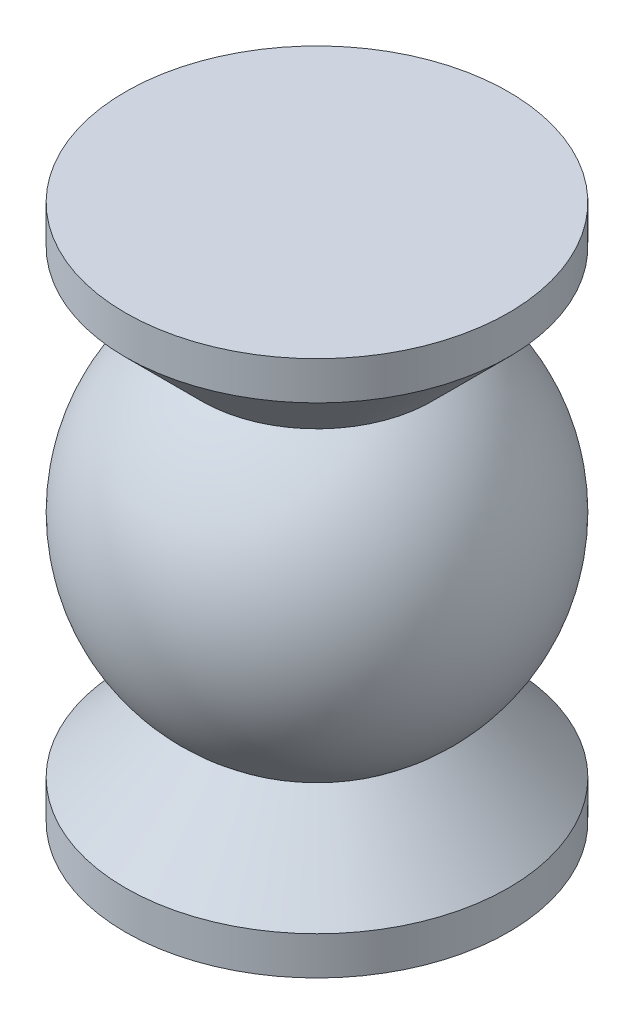
ISO-10303-21;
HEADER;
FILE_DESCRIPTION(('STEP AP214'),'2;1');
FILE_NAME('part.step','',(''),(''),'','','');
FILE_SCHEMA(('AUTOMOTIVE_DESIGN { 1 0 10303 214 1 1 1 1 }'));
ENDSEC;
DATA;
#1=APPLICATION_CONTEXT('core data for automotive mechanical design processes');
#2=APPLICATION_PROTOCOL_DEFINITION('international standard','automotive_design',2000,#1);
#3=PRODUCT_CONTEXT('',#1,'mechanical');
#4=PRODUCT('Part','Part','',(#3));
#5=PRODUCT_RELATED_PRODUCT_CATEGORY('part','',(#4));
#6=PRODUCT_DEFINITION_FORMATION('','',#4);
#7=PRODUCT_DEFINITION_CONTEXT('part definition',#1,'design');
#8=PRODUCT_DEFINITION('design','',#6,#7);
#9=PRODUCT_DEFINITION_SHAPE('','',#8);
#10=(LENGTH_UNIT() NAMED_UNIT(*) SI_UNIT(.MILLI.,.METRE.));
#11=(NAMED_UNIT(*) PLANE_ANGLE_UNIT() SI_UNIT($,.RADIAN.));
#12=(NAMED_UNIT(*) SI_UNIT($,.STERADIAN.) SOLID_ANGLE_UNIT());
#13=UNCERTAINTY_MEASURE_WITH_UNIT(LENGTH_MEASURE(1.E-05),#10,'distance_accuracy_value','');
#14=(GEOMETRIC_REPRESENTATION_CONTEXT(3) GLOBAL_UNCERTAINTY_ASSIGNED_CONTEXT((#13)) GLOBAL_UNIT_ASSIGNED_CONTEXT((#10,
#11,#12)) REPRESENTATION_CONTEXT('',''));
#15=CARTESIAN_POINT('',(0.,0.,0.));
#16=DIRECTION('',(0.,0.,1.));
#17=DIRECTION('',(1.,0.,0.));
#18=AXIS2_PLACEMENT_3D('',#15,#16,#17);
#19=CARTESIAN_POINT('',(0.,-30.,0.));
#20=DIRECTION('',(0.,-1.,0.));
#21=DIRECTION('',(0.,0.,-1.));
#22=AXIS2_PLACEMENT_3D('',#19,#20,#21);
#23=CONICAL_SURFACE('',#22,25.,0.785398163397448);
#24=CARTESIAN_POINT('',(0.,-20.,0.));
#25=DIRECTION('',(0.,1.,0.));
#26=DIRECTION('',(0.,0.,1.));
#27=AXIS2_PLACEMENT_3D('',#24,#25,#26);
#28=CIRCLE('',#27,15.);
#29=CARTESIAN_POINT('',(0.,-20.,-15.));
#30=VERTEX_POINT('',#29);
#31=EDGE_CURVE('E10',#30,#30,#28,.T.);
#32=ORIENTED_EDGE('',*,*,#31,.F.);
#33=EDGE_LOOP('',(#32));
#34=FACE_BOUND('',#33,.T.);
#35=CARTESIAN_POINT('',(0.,-30.,0.));
#36=DIRECTION('',(0.,1.,0.));
#37=DIRECTION('',(0.,0.,1.));
#38=AXIS2_PLACEMENT_3D('',#35,#36,#37);
#39=CIRCLE('',#38,25.);
#40=CARTESIAN_POINT('',(0.,-30.,25.));
#41=VERTEX_POINT('',#40);
#42=EDGE_CURVE('E70',#41,#41,#39,.T.);
#43=ORIENTED_EDGE('',*,*,#42,.T.);
#44=EDGE_LOOP('',(#43));
#45=FACE_BOUND('',#44,.T.);
#46=ADVANCED_FACE('F43',(#34,#45),#23,.T.);
#47=CARTESIAN_POINT('',(0.,0.,0.));
#48=DIRECTION('',(0.,1.,0.));
#49=DIRECTION('',(0.,0.,-1.));
#50=AXIS2_PLACEMENT_3D('',#47,#48,#49);
#51=SPHERICAL_SURFACE('',#50,25.);
#52=CARTESIAN_POINT('',(0.,20.,0.));
#53=DIRECTION('',(0.,1.,0.));
#54=DIRECTION('',(0.,0.,1.));
#55=AXIS2_PLACEMENT_3D('',#52,#53,#54);
#56=CIRCLE('',#55,15.);
#57=CARTESIAN_POINT('',(0.,20.,-15.));
#58=VERTEX_POINT('',#57);
#59=EDGE_CURVE('E50',#58,#58,#56,.T.);
#60=CARTESIAN_POINT('',(0.,20.,-15.));
#61=CARTESIAN_POINT('',(0.,19.7102331585329,-15.386383877575));
#62=CARTESIAN_POINT('',(0.,19.4092445387064,-15.764349304277));
#63=CARTESIAN_POINT('',(0.,18.785891059142,-16.5022218904126));
#64=CARTESIAN_POINT('',(0.,18.4635261994041,-16.8621290498462));
#65=CARTESIAN_POINT('',(0.,17.7984875568239,-17.5626637359227));
#66=CARTESIAN_POINT('',(0.,17.4558137739817,-17.9032912625656));
#67=CARTESIAN_POINT('',(0.,16.751312031891,-18.5641263057405));
#68=CARTESIAN_POINT('',(0.,16.3894840726425,-18.8843338222726));
#69=CARTESIAN_POINT('',(0.,15.6478878896459,-19.5032526836538));
#70=CARTESIAN_POINT('',(0.,15.2681196658977,-19.8019640285029));
#71=CARTESIAN_POINT('',(0.,14.4919184892619,-20.3768877346255));
#72=CARTESIAN_POINT('',(0.,14.0954855363742,-20.6531000958988));
#73=CARTESIAN_POINT('',(0.,13.2872860261715,-21.1820982609088));
#74=CARTESIAN_POINT('',(0.,12.8755194688565,-21.4348840646454));
#75=CARTESIAN_POINT('',(0.,12.0380354631662,-21.9161802896365));
#76=CARTESIAN_POINT('',(0.,11.6123180147909,-22.1446907108911));
#77=CARTESIAN_POINT('',(0.,10.748361760207,-22.5766688391047));
#78=CARTESIAN_POINT('',(0.,10.3101229539983,-22.7801365460637));
#79=CARTESIAN_POINT('',(0.,9.42259557021362,-23.1613460121235));
#80=CARTESIAN_POINT('',(0.,8.97330699263761,-23.3390877712243));
#81=CARTESIAN_POINT('',(0.,8.06518875528102,-23.6682484928968));
#82=CARTESIAN_POINT('',(0.,7.60635909550044,-23.8196674554685));
#83=CARTESIAN_POINT('',(0.,6.6806994219065,-24.0956741265362));
#84=CARTESIAN_POINT('',(0.,6.21386940809315,-24.2202618350321));
#85=CARTESIAN_POINT('',(0.,5.27377661927491,-24.4421876383544));
#86=CARTESIAN_POINT('',(0.,4.80051384427003,-24.5395257331807));
#87=CARTESIAN_POINT('',(0.,3.84914472685123,-24.7066254525011));
#88=CARTESIAN_POINT('',(0.,3.37103838443732,-24.7763870769951));
#89=CARTESIAN_POINT('',(0.,2.41158759044098,-24.8880995994487));
#90=CARTESIAN_POINT('',(0.,1.93024313885855,-24.9300504974084));
#91=CARTESIAN_POINT('',(0.,0.965932458184081,-24.9860006976841));
#92=CARTESIAN_POINT('',(0.,0.482966229092041,-25.));
#93=CARTESIAN_POINT('',(0.,-0.482966229092041,-25.));
#94=CARTESIAN_POINT('',(0.,-0.965932458184081,-24.9860006976841));
#95=CARTESIAN_POINT('',(0.,-1.93024313885855,-24.9300504974084));
#96=CARTESIAN_POINT('',(0.,-2.41158759044098,-24.8880995994487));
#97=CARTESIAN_POINT('',(0.,-3.37103838443732,-24.7763870769951));
#98=CARTESIAN_POINT('',(0.,-3.84914472685123,-24.7066254525011));
#99=CARTESIAN_POINT('',(0.,-4.80051384427002,-24.5395257331807));
#100=CARTESIAN_POINT('',(0.,-5.27377661927491,-24.4421876383544));
#101=CARTESIAN_POINT('',(0.,-6.21386940809315,-24.2202618350321));
#102=CARTESIAN_POINT('',(0.,-6.6806994219065,-24.0956741265362));
#103=CARTESIAN_POINT('',(0.,-7.60635909550044,-23.8196674554685));
#104=CARTESIAN_POINT('',(0.,-8.06518875528102,-23.6682484928968));
#105=CARTESIAN_POINT('',(0.,-8.97330699263761,-23.3390877712243));
#106=CARTESIAN_POINT('',(0.,-9.42259557021363,-23.1613460121235));
#107=CARTESIAN_POINT('',(0.,-10.3101229539983,-22.7801365460637));
#108=CARTESIAN_POINT('',(0.,-10.748361760207,-22.5766688391047));
#109=CARTESIAN_POINT('',(0.,-11.6123180147909,-22.1446907108911));
#110=CARTESIAN_POINT('',(0.,-12.0380354631662,-21.9161802896365));
#111=CARTESIAN_POINT('',(0.,-12.8755194688565,-21.4348840646454));
#112=CARTESIAN_POINT('',(0.,-13.2872860261715,-21.1820982609088));
#113=CARTESIAN_POINT('',(0.,-14.0954855363742,-20.6531000958988));
#114=CARTESIAN_POINT('',(0.,-14.4919184892619,-20.3768877346255));
#115=CARTESIAN_POINT('',(0.,-15.2681196658977,-19.8019640285029));
#116=CARTESIAN_POINT('',(0.,-15.6478878896459,-19.5032526836538));
#117=CARTESIAN_POINT('',(0.,-16.3894840726425,-18.8843338222726));
#118=CARTESIAN_POINT('',(0.,-16.751312031891,-18.5641263057405));
#119=CARTESIAN_POINT('',(0.,-17.4558137739817,-17.9032912625656));
#120=CARTESIAN_POINT('',(0.,-17.7984875568239,-17.5626637359227));
#121=CARTESIAN_POINT('',(0.,-18.4635261994041,-16.8621290498462));
#122=CARTESIAN_POINT('',(0.,-18.785891059142,-16.5022218904126));
#123=CARTESIAN_POINT('',(0.,-19.4092445387064,-15.764349304277));
#124=CARTESIAN_POINT('',(0.,-19.7102331585328,-15.386383877575));
#125=CARTESIAN_POINT('',(0.,-20.,-15.));
#126=B_SPLINE_CURVE_WITH_KNOTS('',3,(#60,#61,#62,#63,#64,#65,#66,#67,#68,#69,#70,#71,#72,#73,
#74,#75,#76,#77,#78,#79,#80,#81,#82,#83,#84,#85,#86,#87,#88,#89,#90,#91,#92,#93,#94,#95,#96,#97,
#98,#99,#100,#101,#102,#103,#104,#105,#106,#107,#108,#109,#110,#111,#112,#113,#114,#115,#116,
#117,#118,#119,#120,#121,#122,#123,#124,#125),.UNSPECIFIED.,.F.,.F.,(4,2,2,2,2,2,2,2,2,2,2,2,2,
2,2,2,2,2,2,2,2,2,2,2,2,2,2,2,2,2,2,2,4),(0.,1.4486960076868,2.8973920153736,4.34608802306039,
5.79478403074719,7.24348003843398,8.69217604612078,10.1408720538076,11.5895680614944,
13.0382640691812,14.486960076868,15.9356560845548,17.3843520922416,18.8330480999284,
20.2817441076152,21.730440115302,23.1791361229888,24.6278321306756,26.0765281383623,
27.5252241460491,28.9739201537359,30.4226161614227,31.8713121691095,33.3200081767963,
34.7687041844831,36.2174001921699,37.6660961998567,39.1147922075435,40.5634882152303,
42.0121842229171,43.4608802306039,44.9095762382907,46.3582722459775),.UNSPECIFIED.);
#127=EDGE_CURVE('BSEAM93',#58,#30,#126,.T.);
#128=ORIENTED_EDGE('',*,*,#59,.F.);
#129=ORIENTED_EDGE('',*,*,#31,.T.);
#130=ORIENTED_EDGE('',*,*,#127,.T.);
#131=ORIENTED_EDGE('',*,*,#127,.F.);
#132=EDGE_LOOP('',(#128,#130,#129,#131));
#133=FACE_BOUND('',#132,.T.);
#134=ADVANCED_FACE('F93',(#133),#51,.T.);
#135=CARTESIAN_POINT('',(0.,30.,0.));
#136=DIRECTION('',(0.,1.,0.));
#137=DIRECTION('',(0.,0.,1.));
#138=AXIS2_PLACEMENT_3D('',#135,#136,#137);
#139=CONICAL_SURFACE('',#138,25.,0.785398163397448);
#140=ORIENTED_EDGE('',*,*,#59,.T.);
#141=EDGE_LOOP('',(#140));
#142=FACE_BOUND('',#141,.T.);
#143=CARTESIAN_POINT('',(0.,30.,0.));
#144=DIRECTION('',(0.,1.,0.));
#145=DIRECTION('',(0.,0.,1.));
#146=AXIS2_PLACEMENT_3D('',#143,#144,#145);
#147=CIRCLE('',#146,25.);
#148=CARTESIAN_POINT('',(0.,30.,25.));
#149=VERTEX_POINT('',#148);
#150=EDGE_CURVE('E55',#149,#149,#147,.T.);
#151=ORIENTED_EDGE('',*,*,#150,.F.);
#152=EDGE_LOOP('',(#151));
#153=FACE_BOUND('',#152,.T.);
#154=ADVANCED_FACE('F98',(#142,#153),#139,.T.);
#155=CARTESIAN_POINT('',(0.,40.5935115250045,0.));
#156=DIRECTION('',(0.,1.,0.));
#157=DIRECTION('',(0.,0.,1.));
#158=AXIS2_PLACEMENT_3D('',#155,#156,#157);
#159=CYLINDRICAL_SURFACE('',#158,25.);
#160=ORIENTED_EDGE('',*,*,#150,.T.);
#161=EDGE_LOOP('',(#160));
#162=FACE_BOUND('',#161,.T.);
#163=CARTESIAN_POINT('',(0.,35.,0.));
#164=DIRECTION('',(0.,1.,0.));
#165=DIRECTION('',(0.,0.,1.));
#166=AXIS2_PLACEMENT_3D('',#163,#164,#165);
#167=CIRCLE('',#166,25.);
#168=CARTESIAN_POINT('',(0.,35.,25.));
#169=VERTEX_POINT('',#168);
#170=EDGE_CURVE('E60',#169,#169,#167,.T.);
#171=ORIENTED_EDGE('',*,*,#170,.F.);
#172=EDGE_LOOP('',(#171));
#173=FACE_BOUND('',#172,.T.);
#174=ADVANCED_FACE('F89',(#162,#173),#159,.T.);
#175=CARTESIAN_POINT('',(0.,35.,0.));
#176=DIRECTION('',(0.,1.,0.));
#177=DIRECTION('',(0.,0.,1.));
#178=AXIS2_PLACEMENT_3D('',#175,#176,#177);
#179=PLANE('',#178);
#180=ORIENTED_EDGE('',*,*,#170,.T.);
#181=EDGE_LOOP('',(#180));
#182=FACE_BOUND('',#181,.T.);
#183=ADVANCED_FACE('F84',(#182),#179,.T.);
#184=CARTESIAN_POINT('',(0.,-35.,0.));
#185=DIRECTION('',(0.,1.,0.));
#186=DIRECTION('',(0.,0.,1.));
#187=AXIS2_PLACEMENT_3D('',#184,#185,#186);
#188=PLANE('',#187);
#189=CARTESIAN_POINT('',(0.,-35.,0.));
#190=DIRECTION('',(0.,1.,0.));
#191=DIRECTION('',(0.,0.,1.));
#192=AXIS2_PLACEMENT_3D('',#189,#190,#191);
#193=CIRCLE('',#192,25.);
#194=CARTESIAN_POINT('',(0.,-35.,25.));
#195=VERTEX_POINT('',#194);
#196=EDGE_CURVE('E66',#195,#195,#193,.T.);
#197=ORIENTED_EDGE('',*,*,#196,.F.);
#198=EDGE_LOOP('',(#197));
#199=FACE_BOUND('',#198,.T.);
#200=ADVANCED_FACE('F79',(#199),#188,.F.);
#201=CARTESIAN_POINT('',(0.,40.5935115250045,0.));
#202=DIRECTION('',(0.,1.,0.));
#203=DIRECTION('',(0.,0.,1.));
#204=AXIS2_PLACEMENT_3D('',#201,#202,#203);
#205=CYLINDRICAL_SURFACE('',#204,25.);
#206=ORIENTED_EDGE('',*,*,#42,.F.);
#207=EDGE_LOOP('',(#206));
#208=FACE_BOUND('',#207,.T.);
#209=ORIENTED_EDGE('',*,*,#196,.T.);
#210=EDGE_LOOP('',(#209));
#211=FACE_BOUND('',#210,.T.);
#212=ADVANCED_FACE('F76',(#208,#211),#205,.T.);
#213=CLOSED_SHELL('',(#46,#134,#154,#174,#183,#200,#212));
#214=MANIFOLD_SOLID_BREP('B2',#213);
#215=ADVANCED_BREP_SHAPE_REPRESENTATION('',(#18,#214),#14);
#216=SHAPE_DEFINITION_REPRESENTATION(#9,#215);
ENDSEC;
END-ISO-10303-21;
